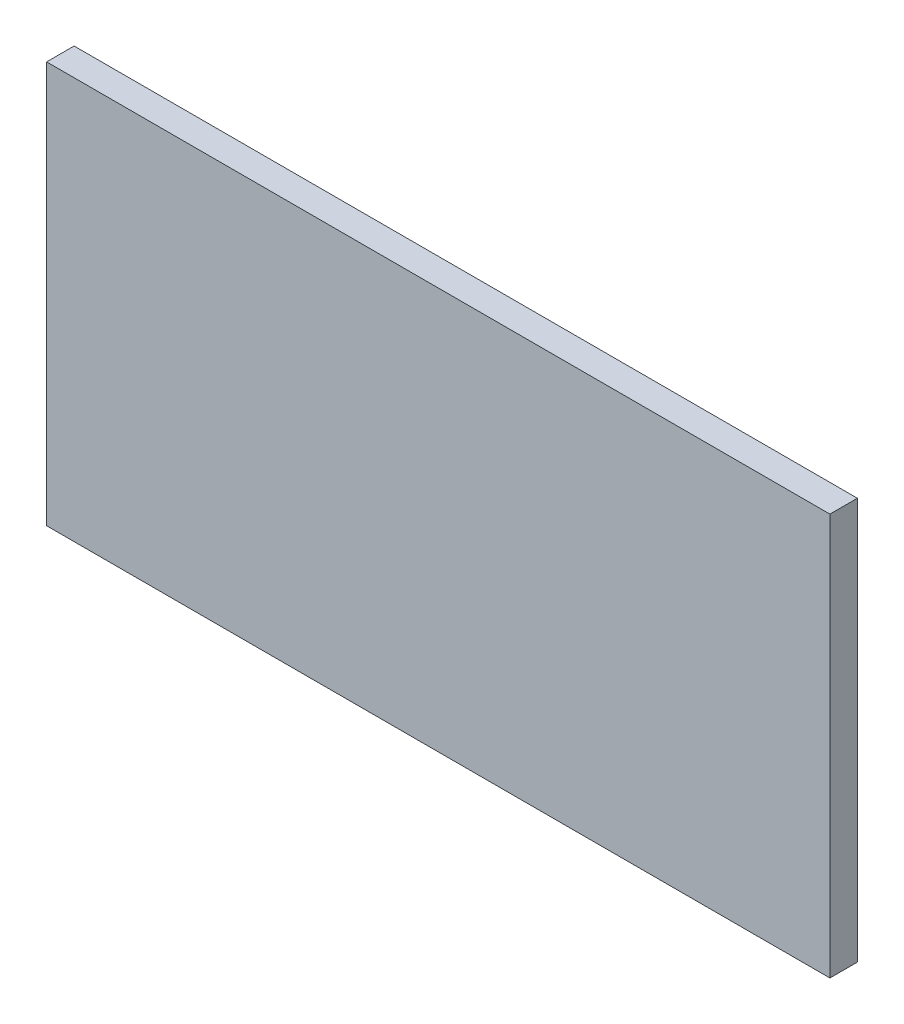
ISO-10303-21;
HEADER;
FILE_DESCRIPTION(('STEP AP214'),'2;1');
FILE_NAME('part.step','',(''),(''),'','','');
FILE_SCHEMA(('AUTOMOTIVE_DESIGN { 1 0 10303 214 1 1 1 1 }'));
ENDSEC;
DATA;
#1=APPLICATION_CONTEXT('core data for automotive mechanical design processes');
#2=APPLICATION_PROTOCOL_DEFINITION('international standard','automotive_design',2000,#1);
#3=PRODUCT_CONTEXT('',#1,'mechanical');
#4=PRODUCT('Part','Part','',(#3));
#5=PRODUCT_RELATED_PRODUCT_CATEGORY('part','',(#4));
#6=PRODUCT_DEFINITION_FORMATION('','',#4);
#7=PRODUCT_DEFINITION_CONTEXT('part definition',#1,'design');
#8=PRODUCT_DEFINITION('design','',#6,#7);
#9=PRODUCT_DEFINITION_SHAPE('','',#8);
#10=(LENGTH_UNIT() NAMED_UNIT(*) SI_UNIT(.MILLI.,.METRE.));
#11=(NAMED_UNIT(*) PLANE_ANGLE_UNIT() SI_UNIT($,.RADIAN.));
#12=(NAMED_UNIT(*) SI_UNIT($,.STERADIAN.) SOLID_ANGLE_UNIT());
#13=UNCERTAINTY_MEASURE_WITH_UNIT(LENGTH_MEASURE(1.E-05),#10,'distance_accuracy_value','');
#14=(GEOMETRIC_REPRESENTATION_CONTEXT(3) GLOBAL_UNCERTAINTY_ASSIGNED_CONTEXT((#13)) GLOBAL_UNIT_ASSIGNED_CONTEXT((#10,
#11,#12)) REPRESENTATION_CONTEXT('',''));
#15=CARTESIAN_POINT('',(0.,0.,0.));
#16=DIRECTION('',(0.,0.,1.));
#17=DIRECTION('',(1.,0.,0.));
#18=AXIS2_PLACEMENT_3D('',#15,#16,#17);
#19=CARTESIAN_POINT('',(0.,0.,0.));
#20=DIRECTION('',(0.,0.,1.));
#21=DIRECTION('',(1.,0.,0.));
#22=AXIS2_PLACEMENT_3D('',#19,#20,#21);
#23=PLANE('',#22);
#24=DIRECTION('',(-1.,0.,0.));
#25=VECTOR('',#24,1.);
#26=CARTESIAN_POINT('',(0.,69.8959813156576,0.));
#27=LINE('',#26,#25);
#28=CARTESIAN_POINT('',(275.,69.8959813156576,0.));
#29=VERTEX_POINT('',#28);
#30=CARTESIAN_POINT('',(51.,69.8959813156576,0.));
#31=VERTEX_POINT('',#30);
#32=EDGE_CURVE('E99',#29,#31,#27,.T.);
#33=ORIENTED_EDGE('',*,*,#32,.F.);
#34=DIRECTION('',(0.,1.,0.));
#35=VECTOR('',#34,1.);
#36=CARTESIAN_POINT('',(275.,0.,0.));
#37=LINE('',#36,#35);
#38=CARTESIAN_POINT('',(275.,-45.,0.));
#39=VERTEX_POINT('',#38);
#40=EDGE_CURVE('E82',#39,#29,#37,.T.);
#41=ORIENTED_EDGE('',*,*,#40,.F.);
#42=DIRECTION('',(-1.,0.,0.));
#43=VECTOR('',#42,1.);
#44=CARTESIAN_POINT('',(0.,-45.,0.));
#45=LINE('',#44,#43);
#46=CARTESIAN_POINT('',(51.,-45.,0.));
#47=VERTEX_POINT('',#46);
#48=EDGE_CURVE('E97',#39,#47,#45,.T.);
#49=ORIENTED_EDGE('',*,*,#48,.T.);
#50=DIRECTION('',(0.,-1.,0.));
#51=VECTOR('',#50,1.);
#52=CARTESIAN_POINT('',(51.,74.8959813156576,0.));
#53=LINE('',#52,#51);
#54=EDGE_CURVE('E44',#31,#47,#53,.T.);
#55=ORIENTED_EDGE('',*,*,#54,.F.);
#56=EDGE_LOOP('',(#33,#41,#49,#55));
#57=FACE_BOUND('',#56,.T.);
#58=ADVANCED_FACE('F40',(#57),#23,.F.);
#59=CARTESIAN_POINT('',(51.,74.8959813156576,268.705429951217));
#60=DIRECTION('',(1.,0.,0.));
#61=DIRECTION('',(0.,0.,-1.));
#62=AXIS2_PLACEMENT_3D('',#59,#60,#61);
#63=PLANE('',#62);
#64=DIRECTION('',(0.,0.,1.));
#65=VECTOR('',#64,1.);
#66=CARTESIAN_POINT('',(51.,-45.,-229.054578648845));
#67=LINE('',#66,#65);
#68=CARTESIAN_POINT('',(51.,-45.,7.86063673348532));
#69=VERTEX_POINT('',#68);
#70=EDGE_CURVE('E101',#47,#69,#67,.T.);
#71=ORIENTED_EDGE('',*,*,#70,.T.);
#72=DIRECTION('',(0.,1.,0.));
#73=VECTOR('',#72,1.);
#74=CARTESIAN_POINT('',(51.,74.8959813156577,7.8606367334853));
#75=LINE('',#74,#73);
#76=CARTESIAN_POINT('',(51.,69.8959813156576,7.8606367334853));
#77=VERTEX_POINT('',#76);
#78=EDGE_CURVE('E11',#69,#77,#75,.T.);
#79=ORIENTED_EDGE('',*,*,#78,.T.);
#80=DIRECTION('',(0.,0.,1.));
#81=VECTOR('',#80,1.);
#82=CARTESIAN_POINT('',(51.,69.8959813156576,-229.054578648845));
#83=LINE('',#82,#81);
#84=EDGE_CURVE('E96',#31,#77,#83,.T.);
#85=ORIENTED_EDGE('',*,*,#84,.F.);
#86=ORIENTED_EDGE('',*,*,#54,.T.);
#87=EDGE_LOOP('',(#71,#79,#85,#86));
#88=FACE_BOUND('',#87,.T.);
#89=ADVANCED_FACE('F42',(#88),#63,.F.);
#90=CARTESIAN_POINT('',(45.,0.,7.86063673348532));
#91=DIRECTION('',(0.,0.,-1.));
#92=DIRECTION('',(0.,1.,0.));
#93=AXIS2_PLACEMENT_3D('',#90,#91,#92);
#94=PLANE('',#93);
#95=DIRECTION('',(1.,0.,0.));
#96=VECTOR('',#95,1.);
#97=CARTESIAN_POINT('',(0.,-45.,7.86063673348532));
#98=LINE('',#97,#96);
#99=CARTESIAN_POINT('',(275.,-45.,7.86063673348532));
#100=VERTEX_POINT('',#99);
#101=EDGE_CURVE('E93',#69,#100,#98,.T.);
#102=ORIENTED_EDGE('',*,*,#101,.T.);
#103=DIRECTION('',(0.,-1.,0.));
#104=VECTOR('',#103,1.);
#105=CARTESIAN_POINT('',(275.,0.,7.86063673348532));
#106=LINE('',#105,#104);
#107=CARTESIAN_POINT('',(275.,69.8959813156576,7.86063673348532));
#108=VERTEX_POINT('',#107);
#109=EDGE_CURVE('E55',#108,#100,#106,.T.);
#110=ORIENTED_EDGE('',*,*,#109,.F.);
#111=DIRECTION('',(1.,0.,0.));
#112=VECTOR('',#111,1.);
#113=CARTESIAN_POINT('',(0.,69.8959813156576,7.86063673348532));
#114=LINE('',#113,#112);
#115=EDGE_CURVE('E92',#77,#108,#114,.T.);
#116=ORIENTED_EDGE('',*,*,#115,.F.);
#117=ORIENTED_EDGE('',*,*,#78,.F.);
#118=EDGE_LOOP('',(#102,#110,#116,#117));
#119=FACE_BOUND('',#118,.T.);
#120=ADVANCED_FACE('F91',(#119),#94,.F.);
#121=CARTESIAN_POINT('',(0.,69.8959813156576,-229.054578648845));
#122=DIRECTION('',(0.,-1.,0.));
#123=DIRECTION('',(0.,0.,-1.));
#124=AXIS2_PLACEMENT_3D('',#121,#122,#123);
#125=PLANE('',#124);
#126=ORIENTED_EDGE('',*,*,#115,.T.);
#127=DIRECTION('',(0.,0.,1.));
#128=VECTOR('',#127,1.);
#129=CARTESIAN_POINT('',(275.,69.8959813156576,-115.004723913794));
#130=LINE('',#129,#128);
#131=EDGE_CURVE('E79',#29,#108,#130,.T.);
#132=ORIENTED_EDGE('',*,*,#131,.F.);
#133=ORIENTED_EDGE('',*,*,#32,.T.);
#134=ORIENTED_EDGE('',*,*,#84,.T.);
#135=EDGE_LOOP('',(#126,#132,#133,#134));
#136=FACE_BOUND('',#135,.T.);
#137=ADVANCED_FACE('F95',(#136),#125,.F.);
#138=CARTESIAN_POINT('',(0.,-45.,-229.054578648845));
#139=DIRECTION('',(0.,-1.,0.));
#140=DIRECTION('',(0.,0.,-1.));
#141=AXIS2_PLACEMENT_3D('',#138,#139,#140);
#142=PLANE('',#141);
#143=DIRECTION('',(0.,0.,1.));
#144=VECTOR('',#143,1.);
#145=CARTESIAN_POINT('',(275.,-45.,-115.004723913794));
#146=LINE('',#145,#144);
#147=EDGE_CURVE('E86',#39,#100,#146,.T.);
#148=ORIENTED_EDGE('',*,*,#147,.T.);
#149=ORIENTED_EDGE('',*,*,#101,.F.);
#150=ORIENTED_EDGE('',*,*,#70,.F.);
#151=ORIENTED_EDGE('',*,*,#48,.F.);
#152=EDGE_LOOP('',(#148,#149,#150,#151));
#153=FACE_BOUND('',#152,.T.);
#154=ADVANCED_FACE('F112',(#153),#142,.T.);
#155=CARTESIAN_POINT('',(275.,0.,-115.004723913794));
#156=DIRECTION('',(-1.,0.,0.));
#157=DIRECTION('',(0.,0.,1.));
#158=AXIS2_PLACEMENT_3D('',#155,#156,#157);
#159=PLANE('',#158);
#160=ORIENTED_EDGE('',*,*,#40,.T.);
#161=ORIENTED_EDGE('',*,*,#131,.T.);
#162=ORIENTED_EDGE('',*,*,#109,.T.);
#163=ORIENTED_EDGE('',*,*,#147,.F.);
#164=EDGE_LOOP('',(#160,#161,#162,#163));
#165=FACE_BOUND('',#164,.T.);
#166=ADVANCED_FACE('F80',(#165),#159,.F.);
#167=CLOSED_SHELL('',(#58,#89,#120,#137,#154,#166));
#168=MANIFOLD_SOLID_BREP('B2',#167);
#169=ADVANCED_BREP_SHAPE_REPRESENTATION('',(#18,#168),#14);
#170=SHAPE_DEFINITION_REPRESENTATION(#9,#169);
ENDSEC;
END-ISO-10303-21;
